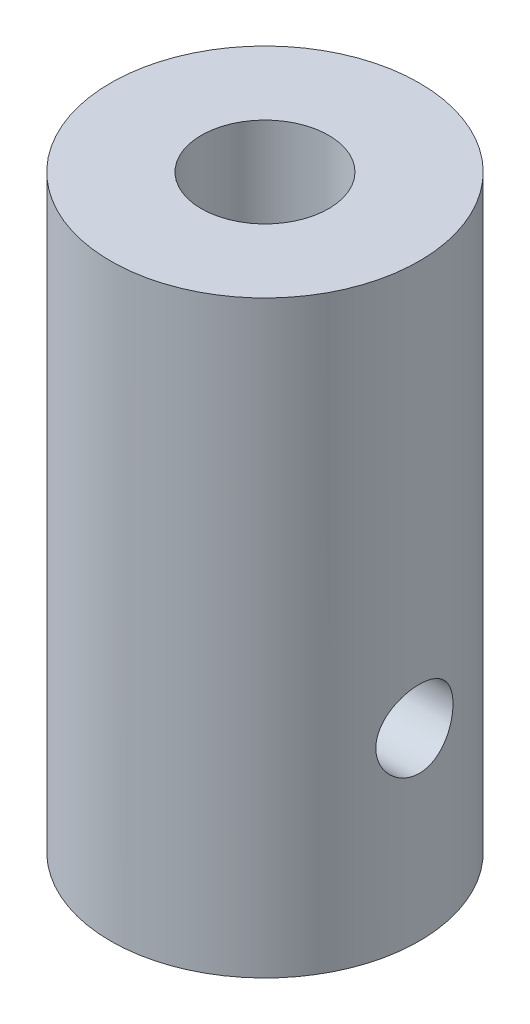
ISO-10303-21;
HEADER;
FILE_DESCRIPTION(('STEP AP214'),'2;1');
FILE_NAME('part.step','',(''),(''),'','','');
FILE_SCHEMA(('AUTOMOTIVE_DESIGN { 1 0 10303 214 1 1 1 1 }'));
ENDSEC;
DATA;
#1=APPLICATION_CONTEXT('core data for automotive mechanical design processes');
#2=APPLICATION_PROTOCOL_DEFINITION('international standard','automotive_design',2000,#1);
#3=PRODUCT_CONTEXT('',#1,'mechanical');
#4=PRODUCT('Part','Part','',(#3));
#5=PRODUCT_RELATED_PRODUCT_CATEGORY('part','',(#4));
#6=PRODUCT_DEFINITION_FORMATION('','',#4);
#7=PRODUCT_DEFINITION_CONTEXT('part definition',#1,'design');
#8=PRODUCT_DEFINITION('design','',#6,#7);
#9=PRODUCT_DEFINITION_SHAPE('','',#8);
#10=(LENGTH_UNIT() NAMED_UNIT(*) SI_UNIT(.MILLI.,.METRE.));
#11=(NAMED_UNIT(*) PLANE_ANGLE_UNIT() SI_UNIT($,.RADIAN.));
#12=(NAMED_UNIT(*) SI_UNIT($,.STERADIAN.) SOLID_ANGLE_UNIT());
#13=UNCERTAINTY_MEASURE_WITH_UNIT(LENGTH_MEASURE(1.E-05),#10,'distance_accuracy_value','');
#14=(GEOMETRIC_REPRESENTATION_CONTEXT(3) GLOBAL_UNCERTAINTY_ASSIGNED_CONTEXT((#13)) GLOBAL_UNIT_ASSIGNED_CONTEXT((#10,
#11,#12)) REPRESENTATION_CONTEXT('',''));
#15=CARTESIAN_POINT('',(0.,0.,0.));
#16=DIRECTION('',(0.,0.,1.));
#17=DIRECTION('',(1.,0.,0.));
#18=AXIS2_PLACEMENT_3D('',#15,#16,#17);
#19=CARTESIAN_POINT('',(0.,-19.765000094,0.));
#20=DIRECTION('',(0.,1.,0.));
#21=DIRECTION('',(0.,0.,1.));
#22=AXIS2_PLACEMENT_3D('',#19,#20,#21);
#23=PLANE('',#22);
#24=CARTESIAN_POINT('',(0.,-19.765000094,0.));
#25=DIRECTION('',(0.,1.,0.));
#26=DIRECTION('',(0.,0.,1.));
#27=AXIS2_PLACEMENT_3D('',#24,#25,#26);
#28=CIRCLE('',#27,4.000000001);
#29=CARTESIAN_POINT('',(0.,-19.765000094,4.000000001));
#30=VERTEX_POINT('',#29);
#31=EDGE_CURVE('E63',#30,#30,#28,.T.);
#32=ORIENTED_EDGE('',*,*,#31,.F.);
#33=EDGE_LOOP('',(#32));
#34=FACE_BOUND('',#33,.T.);
#35=ADVANCED_FACE('F35',(#34),#23,.F.);
#36=CARTESIAN_POINT('',(0.,6.81370834181319,0.));
#37=DIRECTION('',(0.,-1.,0.));
#38=DIRECTION('',(0.,0.,-1.));
#39=AXIS2_PLACEMENT_3D('',#36,#37,#38);
#40=CYLINDRICAL_SURFACE('',#39,4.000000001);
#41=CARTESIAN_POINT('',(-3.87298334724022,-14.999999988,-0.999999999999989));
#42=CARTESIAN_POINT('',(-3.87298440160465,-14.9447796876427,-0.999998431438687));
#43=CARTESIAN_POINT('',(-3.87417722602529,-14.8895420285677,-0.995410498207978));
#44=CARTESIAN_POINT('',(-3.87880744995384,-14.7806529567654,-0.977209250194022));
#45=CARTESIAN_POINT('',(-3.88224615577231,-14.7270024862176,-0.963590682697397));
#46=CARTESIAN_POINT('',(-3.89095489915848,-14.6228785727087,-0.927796479848235));
#47=CARTESIAN_POINT('',(-3.89622257172067,-14.5724011258382,-0.905631891139077));
#48=CARTESIAN_POINT('',(-3.90799276920747,-14.4758756469826,-0.8534084565024));
#49=CARTESIAN_POINT('',(-3.91449534655503,-14.4298278031635,-0.823349275420825));
#50=CARTESIAN_POINT('',(-3.92816286642291,-14.3424553298886,-0.755483370919641));
#51=CARTESIAN_POINT('',(-3.9353383915045,-14.3012425478543,-0.717534755076226));
#52=CARTESIAN_POINT('',(-3.94945150308002,-14.225695430251,-0.635272825634103));
#53=CARTESIAN_POINT('',(-3.95638906727893,-14.1913617377465,-0.590958917665476));
#54=CARTESIAN_POINT('',(-3.96936166308956,-14.1300898009434,-0.496458080424451));
#55=CARTESIAN_POINT('',(-3.97538275060898,-14.1032614327319,-0.446197830470959));
#56=CARTESIAN_POINT('',(-3.98572324870847,-14.0584761303363,-0.341705273710269));
#57=CARTESIAN_POINT('',(-3.99004291034044,-14.0405178872319,-0.28747355431015));
#58=CARTESIAN_POINT('',(-3.99641903639382,-14.0143408541674,-0.17774350349508));
#59=CARTESIAN_POINT('',(-3.99851957637781,-14.0059321302685,-0.122293087812811));
#60=CARTESIAN_POINT('',(-4.00037437742915,-13.9984966362897,-0.0107315276980221));
#61=CARTESIAN_POINT('',(-4.00012898538671,-13.9994684791165,0.0453795178224247));
#62=CARTESIAN_POINT('',(-3.99735238081449,-14.0106299281013,0.155352247180374));
#63=CARTESIAN_POINT('',(-3.99487201036433,-14.0206145180234,0.209236215609722));
#64=CARTESIAN_POINT('',(-3.98796334710166,-14.0491884960226,0.314538247423582));
#65=CARTESIAN_POINT('',(-3.98353495059694,-14.067778342155,0.365956179380907));
#66=CARTESIAN_POINT('',(-3.97315003980902,-14.1132010162807,0.465406703513109));
#67=CARTESIAN_POINT('',(-3.96718007978699,-14.1401068058716,0.513404509778079));
#68=CARTESIAN_POINT('',(-3.95435961624832,-14.2013422596555,0.604275622352412));
#69=CARTESIAN_POINT('',(-3.94750895962129,-14.2356732154344,0.647148035097505));
#70=CARTESIAN_POINT('',(-3.93345485609289,-14.311883484805,0.727774035096312));
#71=CARTESIAN_POINT('',(-3.92624687912036,-14.3539419449518,0.765357679085912));
#72=CARTESIAN_POINT('',(-3.91246017508721,-14.44383997743,0.832976375972309));
#73=CARTESIAN_POINT('',(-3.90588147744609,-14.4916798198109,0.863011076054529));
#74=CARTESIAN_POINT('',(-3.89408198835221,-14.5921160016747,0.914788129029318));
#75=CARTESIAN_POINT('',(-3.88886793593007,-14.6447342801405,0.936489566976235));
#76=CARTESIAN_POINT('',(-3.88047456158967,-14.7530341752457,0.970685620640166));
#77=CARTESIAN_POINT('',(-3.87729480427179,-14.8087151336082,0.983182206555792));
#78=CARTESIAN_POINT('',(-3.87342142518893,-14.9199837886244,0.998331855467294));
#79=CARTESIAN_POINT('',(-3.87266435740737,-14.9755351053474,1.00123618956824));
#80=CARTESIAN_POINT('',(-3.87354937495716,-15.0863287626474,0.997806796204831));
#81=CARTESIAN_POINT('',(-3.87519123943787,-15.1415711311968,0.991473919137196));
#82=CARTESIAN_POINT('',(-3.8806283288501,-15.2492456939991,0.969970185570685));
#83=CARTESIAN_POINT('',(-3.88438788196864,-15.3017090786462,0.954945627307111));
#84=CARTESIAN_POINT('',(-3.89360287411312,-15.4033725711595,0.916647232659992));
#85=CARTESIAN_POINT('',(-3.89905851402258,-15.4525722916414,0.8933724190753));
#86=CARTESIAN_POINT('',(-3.91118454939848,-15.5473764991664,0.838708267161964));
#87=CARTESIAN_POINT('',(-3.91787667545044,-15.5928915240364,0.807168701520177));
#88=CARTESIAN_POINT('',(-3.93166833330743,-15.678075333139,0.73706029291751));
#89=CARTESIAN_POINT('',(-3.9387679319327,-15.717743154678,0.698490294787038));
#90=CARTESIAN_POINT('',(-3.95278961314159,-15.7911244050444,0.614262720964005));
#91=CARTESIAN_POINT('',(-3.95970280926061,-15.8246640130343,0.568451952510097));
#92=CARTESIAN_POINT('',(-3.9723888674646,-15.8835743347926,0.471702682671916));
#93=CARTESIAN_POINT('',(-3.97816178902379,-15.908945474654,0.420764448934344));
#94=CARTESIAN_POINT('',(-3.9878804639582,-15.9505784018191,0.315558201707131));
#95=CARTESIAN_POINT('',(-3.99183932109327,-15.9669057017581,0.261317381003691));
#96=CARTESIAN_POINT('',(-3.99754117458469,-15.9901841218471,0.150749760294469));
#97=CARTESIAN_POINT('',(-3.99928459857438,-15.9971370514979,0.0944233650169874));
#98=CARTESIAN_POINT('',(-4.00034169508793,-16.0013675775751,-0.0170835264679137));
#99=CARTESIAN_POINT('',(-3.99971978979971,-15.9989016970936,-0.0722538269910461));
#100=CARTESIAN_POINT('',(-3.99625896557401,-15.984952160701,-0.181367496440375));
#101=CARTESIAN_POINT('',(-3.99342011257107,-15.9734687729807,-0.235310901806719));
#102=CARTESIAN_POINT('',(-3.98585432954094,-15.9419477682196,-0.340171035671088));
#103=CARTESIAN_POINT('',(-3.98113764602882,-15.9219565346742,-0.39110249460752));
#104=CARTESIAN_POINT('',(-3.97031289013801,-15.8740294089658,-0.488917053068128));
#105=CARTESIAN_POINT('',(-3.9642046423827,-15.8460925153136,-0.535799641291641));
#106=CARTESIAN_POINT('',(-3.95107249782174,-15.7822847539825,-0.625401928449533));
#107=CARTESIAN_POINT('',(-3.94403017046645,-15.7462398450705,-0.667994988325378));
#108=CARTESIAN_POINT('',(-3.92990649154556,-15.6675771360007,-0.746615020294044));
#109=CARTESIAN_POINT('',(-3.92282513053958,-15.624957671875,-0.782640325089814));
#110=CARTESIAN_POINT('',(-3.90927475962599,-15.5333985737691,-0.847762026497822));
#111=CARTESIAN_POINT('',(-3.90281963832503,-15.4843558645571,-0.87671661946336));
#112=CARTESIAN_POINT('',(-3.89143955652588,-15.3819444980455,-0.925926896628646));
#113=CARTESIAN_POINT('',(-3.88651348347463,-15.3285790218607,-0.946188909770654));
#114=CARTESIAN_POINT('',(-3.87951908844264,-15.2294229761464,-0.974422528571738));
#115=CARTESIAN_POINT('',(-3.87708663108833,-15.1841068235955,-0.983993170599689));
#116=CARTESIAN_POINT('',(-3.87381838683595,-15.0925311189873,-0.996782292573592));
#117=CARTESIAN_POINT('',(-3.87298246373919,-15.0462716477438,-1.00000131437051));
#118=CARTESIAN_POINT('',(-3.87298334724022,-14.999999988,-0.999999999999989));
#119=B_SPLINE_CURVE_WITH_KNOTS('',3,(#41,#42,#43,#44,#45,#46,#47,#48,#49,#50,#51,#52,#53,#54,
#55,#56,#57,#58,#59,#60,#61,#62,#63,#64,#65,#66,#67,#68,#69,#70,#71,#72,#73,#74,#75,#76,#77,#78,
#79,#80,#81,#82,#83,#84,#85,#86,#87,#88,#89,#90,#91,#92,#93,#94,#95,#96,#97,#98,#99,#100,#101,
#102,#103,#104,#105,#106,#107,#108,#109,#110,#111,#112,#113,#114,#115,#116,#117,#118),
.UNSPECIFIED.,.T.,.F.,(4,2,2,2,2,2,2,2,2,2,2,2,2,2,2,2,2,2,2,2,2,2,2,2,2,2,2,2,2,2,2,2,2,2,2,2,
2,2,4),(0.,0.165490976676687,0.331078296537178,0.496452290833696,0.661833306990754,
0.830495816740678,0.999174085888167,1.17020598555905,1.34121263935443,1.50875500394781,
1.67627259463088,1.8400730507248,2.00388222687037,2.16917149699068,2.33448954185021,
2.50428186626172,2.67408212477279,2.84470572800593,3.01529280048927,3.1813742990189,
3.34744050870821,3.51078962001245,3.67415808566392,3.84073138341612,4.0073320755209,
4.17810132384094,4.34886166285682,4.51836829120551,4.68784219561314,4.85273378448829,
5.01762046948786,5.18161950622109,5.34563922293685,5.51358838631354,5.68158012624799,
5.85270590912339,6.02370688544984,6.16239130867586,6.30106390034782),.UNSPECIFIED.);
#120=CARTESIAN_POINT('',(-3.87298334724022,-14.999999988,-0.999999999999989));
#121=VERTEX_POINT('',#120);
#122=EDGE_CURVE('E40',#121,#121,#119,.T.);
#123=ORIENTED_EDGE('',*,*,#122,.T.);
#124=EDGE_LOOP('',(#123));
#125=FACE_BOUND('',#124,.T.);
#126=CARTESIAN_POINT('',(3.87298334724022,-14.999999988,-0.999999999999989));
#127=CARTESIAN_POINT('',(3.87298440160465,-15.0552202883573,-0.999998431438687));
#128=CARTESIAN_POINT('',(3.87417722602529,-15.1104579474323,-0.995410498207978));
#129=CARTESIAN_POINT('',(3.87880744995384,-15.2193470192346,-0.977209250194023));
#130=CARTESIAN_POINT('',(3.88224615577231,-15.2729974897824,-0.963590682697397));
#131=CARTESIAN_POINT('',(3.89095489915848,-15.3771214032913,-0.927796479848235));
#132=CARTESIAN_POINT('',(3.89622257172067,-15.4275988501618,-0.905631891139076));
#133=CARTESIAN_POINT('',(3.90799276920747,-15.5241243290174,-0.853408456502399));
#134=CARTESIAN_POINT('',(3.91449534655503,-15.5701721728365,-0.823349275420825));
#135=CARTESIAN_POINT('',(3.92816286642291,-15.6575446461114,-0.755483370919641));
#136=CARTESIAN_POINT('',(3.9353383915045,-15.6987574281458,-0.717534755076226));
#137=CARTESIAN_POINT('',(3.94945150308002,-15.774304545749,-0.635272825634101));
#138=CARTESIAN_POINT('',(3.95638906727894,-15.8086382382535,-0.590958917665473));
#139=CARTESIAN_POINT('',(3.96936166308956,-15.8699101750566,-0.496458080424449));
#140=CARTESIAN_POINT('',(3.97538275060898,-15.8967385432681,-0.446197830470959));
#141=CARTESIAN_POINT('',(3.98572324870847,-15.9415238456637,-0.341705273710269));
#142=CARTESIAN_POINT('',(3.99004291034044,-15.9594820887682,-0.28747355431015));
#143=CARTESIAN_POINT('',(3.99641903639382,-15.9856591218326,-0.17774350349508));
#144=CARTESIAN_POINT('',(3.99851957637781,-15.9940678457315,-0.122293087812811));
#145=CARTESIAN_POINT('',(4.00037437742914,-16.0015033397103,-0.0107315276980221));
#146=CARTESIAN_POINT('',(4.00012898538671,-16.0005314968835,0.0453795178224248));
#147=CARTESIAN_POINT('',(3.99735238081449,-15.9893700478987,0.155352247180374));
#148=CARTESIAN_POINT('',(3.99487201036433,-15.9793854579766,0.209236215609722));
#149=CARTESIAN_POINT('',(3.98796334710166,-15.9508114799774,0.314538247423582));
#150=CARTESIAN_POINT('',(3.98353495059694,-15.932221633845,0.365956179380907));
#151=CARTESIAN_POINT('',(3.97315003980902,-15.8867989597193,0.465406703513108));
#152=CARTESIAN_POINT('',(3.96718007978699,-15.8598931701284,0.513404509778078));
#153=CARTESIAN_POINT('',(3.95435961624832,-15.7986577163445,0.604275622352412));
#154=CARTESIAN_POINT('',(3.94750895962129,-15.7643267605656,0.647148035097506));
#155=CARTESIAN_POINT('',(3.93345485609289,-15.688116491195,0.727774035096313));
#156=CARTESIAN_POINT('',(3.92624687912036,-15.6460580310482,0.765357679085911));
#157=CARTESIAN_POINT('',(3.91246017508721,-15.55615999857,0.832976375972308));
#158=CARTESIAN_POINT('',(3.90588147744609,-15.5083201561891,0.863011076054528));
#159=CARTESIAN_POINT('',(3.89408198835221,-15.4078839743253,0.914788129029318));
#160=CARTESIAN_POINT('',(3.88886793593007,-15.3552656958595,0.936489566976235));
#161=CARTESIAN_POINT('',(3.88047456158967,-15.2469658007543,0.970685620640166));
#162=CARTESIAN_POINT('',(3.87729480427179,-15.1912848423918,0.983182206555792));
#163=CARTESIAN_POINT('',(3.87342142518892,-15.0800161873756,0.998331855467294));
#164=CARTESIAN_POINT('',(3.87266435740737,-15.0244648706526,1.00123618956824));
#165=CARTESIAN_POINT('',(3.87354937495716,-14.9136712133526,0.997806796204831));
#166=CARTESIAN_POINT('',(3.87519123943787,-14.8584288448032,0.991473919137196));
#167=CARTESIAN_POINT('',(3.8806283288501,-14.7507542820009,0.969970185570685));
#168=CARTESIAN_POINT('',(3.88438788196864,-14.6982908973538,0.954945627307111));
#169=CARTESIAN_POINT('',(3.89360287411313,-14.5966274048405,0.916647232659992));
#170=CARTESIAN_POINT('',(3.89905851402258,-14.5474276843586,0.893372419075299));
#171=CARTESIAN_POINT('',(3.91118454939848,-14.4526234768336,0.838708267161965));
#172=CARTESIAN_POINT('',(3.91787667545044,-14.4071084519636,0.807168701520179));
#173=CARTESIAN_POINT('',(3.93166833330743,-14.321924642861,0.737060292917511));
#174=CARTESIAN_POINT('',(3.9387679319327,-14.282256821322,0.698490294787038));
#175=CARTESIAN_POINT('',(3.95278961314159,-14.2088755709556,0.614262720964005));
#176=CARTESIAN_POINT('',(3.95970280926061,-14.1753359629657,0.568451952510096));
#177=CARTESIAN_POINT('',(3.9723888674646,-14.1164256412074,0.471702682671916));
#178=CARTESIAN_POINT('',(3.97816178902379,-14.091054501346,0.420764448934344));
#179=CARTESIAN_POINT('',(3.9878804639582,-14.0494215741809,0.315558201707132));
#180=CARTESIAN_POINT('',(3.99183932109327,-14.0330942742419,0.261317381003692));
#181=CARTESIAN_POINT('',(3.99754117458469,-14.009815854153,0.15074976029447));
#182=CARTESIAN_POINT('',(3.99928459857438,-14.0028629245021,0.0944233650169875));
#183=CARTESIAN_POINT('',(4.00034169508793,-13.9986323984249,-0.017083526467914));
#184=CARTESIAN_POINT('',(3.99971978979971,-14.0010982789064,-0.0722538269910464));
#185=CARTESIAN_POINT('',(3.99625896557401,-14.015047815299,-0.181367496440375));
#186=CARTESIAN_POINT('',(3.99342011257107,-14.0265312030193,-0.23531090180672));
#187=CARTESIAN_POINT('',(3.98585432954094,-14.0580522077804,-0.340171035671088));
#188=CARTESIAN_POINT('',(3.98113764602882,-14.0780434413258,-0.39110249460752));
#189=CARTESIAN_POINT('',(3.97031289013801,-14.1259705670342,-0.488917053068128));
#190=CARTESIAN_POINT('',(3.9642046423827,-14.1539074606864,-0.535799641291641));
#191=CARTESIAN_POINT('',(3.95107249782174,-14.2177152220175,-0.625401928449534));
#192=CARTESIAN_POINT('',(3.94403017046645,-14.2537601309295,-0.667994988325379));
#193=CARTESIAN_POINT('',(3.92990649154556,-14.3324228399993,-0.746615020294045));
#194=CARTESIAN_POINT('',(3.92282513053958,-14.375042304125,-0.782640325089815));
#195=CARTESIAN_POINT('',(3.90927475962599,-14.4666014022309,-0.847762026497822));
#196=CARTESIAN_POINT('',(3.90281963832503,-14.5156441114429,-0.87671661946336));
#197=CARTESIAN_POINT('',(3.89143955652588,-14.6180554779545,-0.925926896628646));
#198=CARTESIAN_POINT('',(3.88651348347463,-14.6714209541393,-0.946188909770654));
#199=CARTESIAN_POINT('',(3.87951908844264,-14.7705769998536,-0.974422528571738));
#200=CARTESIAN_POINT('',(3.87708663108833,-14.8158931524045,-0.983993170599689));
#201=CARTESIAN_POINT('',(3.87381838683595,-14.9074688570127,-0.996782292573592));
#202=CARTESIAN_POINT('',(3.87298246373919,-14.9537283282562,-1.00000131437051));
#203=CARTESIAN_POINT('',(3.87298334724022,-14.999999988,-0.999999999999989));
#204=B_SPLINE_CURVE_WITH_KNOTS('',3,(#126,#127,#128,#129,#130,#131,#132,#133,#134,#135,#136,
#137,#138,#139,#140,#141,#142,#143,#144,#145,#146,#147,#148,#149,#150,#151,#152,#153,#154,#155,
#156,#157,#158,#159,#160,#161,#162,#163,#164,#165,#166,#167,#168,#169,#170,#171,#172,#173,#174,
#175,#176,#177,#178,#179,#180,#181,#182,#183,#184,#185,#186,#187,#188,#189,#190,#191,#192,#193,
#194,#195,#196,#197,#198,#199,#200,#201,#202,#203),.UNSPECIFIED.,.T.,.F.,(4,2,2,2,2,2,2,2,2,2,2,
2,2,2,2,2,2,2,2,2,2,2,2,2,2,2,2,2,2,2,2,2,2,2,2,2,2,2,4),(0.,0.165490976676687,
0.331078296537178,0.496452290833694,0.661833306990754,0.830495816740679,0.999174085888169,
1.17020598555905,1.34121263935443,1.50875500394781,1.67627259463088,1.8400730507248,
2.00388222687037,2.16917149699068,2.33448954185021,2.50428186626172,2.67408212477279,
2.84470572800593,3.01529280048927,3.1813742990189,3.34744050870821,3.51078962001245,
3.67415808566391,3.84073138341612,4.0073320755209,4.17810132384093,4.34886166285682,
4.51836829120551,4.68784219561314,4.85273378448829,5.01762046948786,5.18161950622109,
5.34563922293685,5.51358838631354,5.68158012624799,5.85270590912339,6.02370688544984,
6.16239130867586,6.30106390034782),.UNSPECIFIED.);
#205=CARTESIAN_POINT('',(3.87298334724022,-14.999999988,-0.999999999999989));
#206=VERTEX_POINT('',#205);
#207=EDGE_CURVE('E11',#206,#206,#204,.T.);
#208=ORIENTED_EDGE('',*,*,#207,.T.);
#209=EDGE_LOOP('',(#208));
#210=FACE_BOUND('',#209,.T.);
#211=CARTESIAN_POINT('',(0.,-4.50000016,0.));
#212=DIRECTION('',(0.,-1.,0.));
#213=DIRECTION('',(0.,0.,-1.));
#214=AXIS2_PLACEMENT_3D('',#211,#212,#213);
#215=CIRCLE('',#214,4.000000001);
#216=CARTESIAN_POINT('',(0.,-4.50000016,-4.000000001));
#217=VERTEX_POINT('',#216);
#218=EDGE_CURVE('E47',#217,#217,#215,.T.);
#219=ORIENTED_EDGE('',*,*,#218,.T.);
#220=EDGE_LOOP('',(#219));
#221=FACE_BOUND('',#220,.T.);
#222=ORIENTED_EDGE('',*,*,#31,.T.);
#223=EDGE_LOOP('',(#222));
#224=FACE_BOUND('',#223,.T.);
#225=ADVANCED_FACE('F37',(#125,#210,#221,#224),#40,.T.);
#226=CARTESIAN_POINT('',(0.,-4.50000016,0.));
#227=DIRECTION('',(0.,-1.,0.));
#228=DIRECTION('',(0.,0.,-1.));
#229=AXIS2_PLACEMENT_3D('',#226,#227,#228);
#230=PLANE('',#229);
#231=CARTESIAN_POINT('',(0.,-4.50000015999999,0.));
#232=DIRECTION('',(0.,1.,0.));
#233=DIRECTION('',(0.,0.,1.));
#234=AXIS2_PLACEMENT_3D('',#231,#232,#233);
#235=CIRCLE('',#234,1.64999999999999);
#236=CARTESIAN_POINT('',(0.,-4.50000015999999,1.64999999999999));
#237=VERTEX_POINT('',#236);
#238=EDGE_CURVE('E60',#237,#237,#235,.T.);
#239=ORIENTED_EDGE('',*,*,#238,.F.);
#240=EDGE_LOOP('',(#239));
#241=FACE_BOUND('',#240,.T.);
#242=ORIENTED_EDGE('',*,*,#218,.F.);
#243=EDGE_LOOP('',(#242));
#244=FACE_BOUND('',#243,.T.);
#245=ADVANCED_FACE('F75',(#241,#244),#230,.F.);
#246=CARTESIAN_POINT('',(4.000000001,-14.999999988,0.));
#247=DIRECTION('',(1.,0.,0.));
#248=DIRECTION('',(0.,0.,-1.));
#249=AXIS2_PLACEMENT_3D('',#246,#247,#248);
#250=CYLINDRICAL_SURFACE('',#249,0.999999999999989);
#251=ORIENTED_EDGE('',*,*,#207,.F.);
#252=EDGE_LOOP('',(#251));
#253=FACE_BOUND('',#252,.T.);
#254=ORIENTED_EDGE('',*,*,#122,.F.);
#255=EDGE_LOOP('',(#254));
#256=FACE_BOUND('',#255,.T.);
#257=ADVANCED_FACE('F54',(#253,#256),#250,.F.);
#258=CARTESIAN_POINT('',(0.,-11.50000394,0.));
#259=DIRECTION('',(0.,1.,0.));
#260=DIRECTION('',(0.,0.,1.));
#261=AXIS2_PLACEMENT_3D('',#258,#259,#260);
#262=CONICAL_SURFACE('',#261,1.64999999999998,1.02974425867665);
#263=CARTESIAN_POINT('',(0.,-12.4914239613955,0.));
#264=VERTEX_POINT('',#263);
#265=VERTEX_LOOP('',#264);
#266=FACE_BOUND('',#265,.T.);
#267=CARTESIAN_POINT('',(0.,-11.50000394,0.));
#268=DIRECTION('',(0.,1.,0.));
#269=DIRECTION('',(0.,0.,1.));
#270=AXIS2_PLACEMENT_3D('',#267,#268,#269);
#271=CIRCLE('',#270,1.64999999999998);
#272=CARTESIAN_POINT('',(0.,-11.50000394,1.64999999999998));
#273=VERTEX_POINT('',#272);
#274=EDGE_CURVE('E58',#273,#273,#271,.T.);
#275=ORIENTED_EDGE('',*,*,#274,.T.);
#276=EDGE_LOOP('',(#275));
#277=FACE_BOUND('',#276,.T.);
#278=ADVANCED_FACE('F50',(#266,#277),#262,.F.);
#279=CARTESIAN_POINT('',(0.,-4.50000016,0.));
#280=DIRECTION('',(0.,1.,0.));
#281=DIRECTION('',(0.,0.,1.));
#282=AXIS2_PLACEMENT_3D('',#279,#280,#281);
#283=CYLINDRICAL_SURFACE('',#282,1.64999999999998);
#284=ORIENTED_EDGE('',*,*,#274,.F.);
#285=EDGE_LOOP('',(#284));
#286=FACE_BOUND('',#285,.T.);
#287=ORIENTED_EDGE('',*,*,#238,.T.);
#288=EDGE_LOOP('',(#287));
#289=FACE_BOUND('',#288,.T.);
#290=ADVANCED_FACE('F53',(#286,#289),#283,.F.);
#291=CLOSED_SHELL('',(#35,#225,#245,#257,#278,#290));
#292=MANIFOLD_SOLID_BREP('B2',#291);
#293=ADVANCED_BREP_SHAPE_REPRESENTATION('',(#18,#292),#14);
#294=SHAPE_DEFINITION_REPRESENTATION(#9,#293);
ENDSEC;
END-ISO-10303-21;
